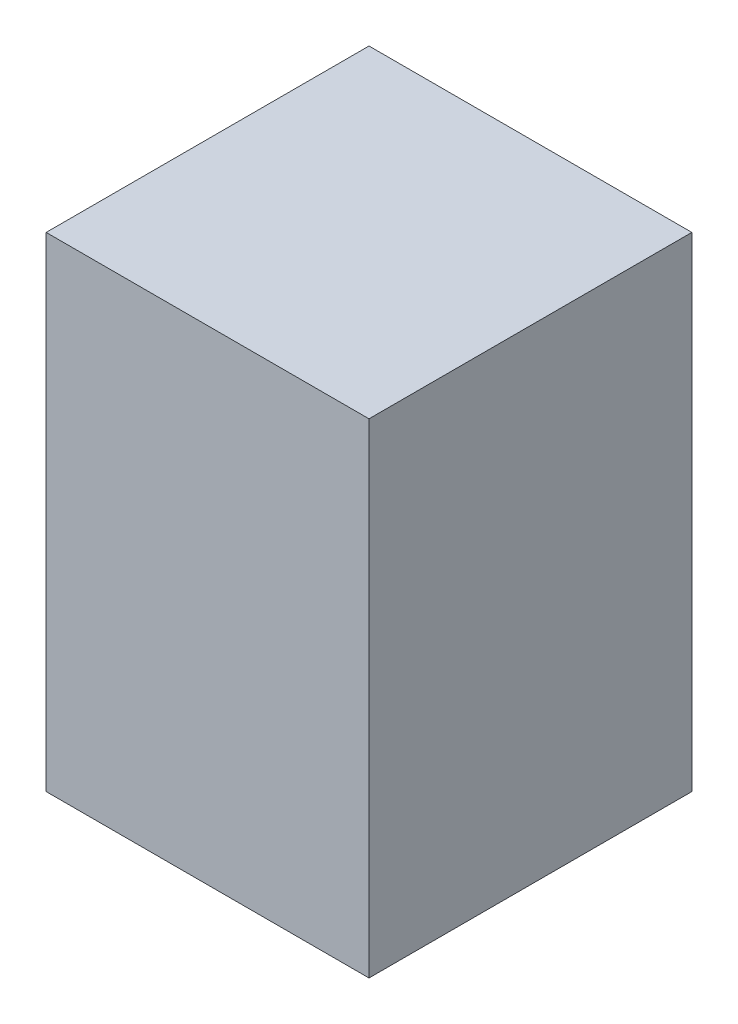
ISO-10303-21;
HEADER;
FILE_DESCRIPTION(('STEP AP214'),'2;1');
FILE_NAME('part.step','',(''),(''),'','','');
FILE_SCHEMA(('AUTOMOTIVE_DESIGN { 1 0 10303 214 1 1 1 1 }'));
ENDSEC;
DATA;
#1=APPLICATION_CONTEXT('core data for automotive mechanical design processes');
#2=APPLICATION_PROTOCOL_DEFINITION('international standard','automotive_design',2000,#1);
#3=PRODUCT_CONTEXT('',#1,'mechanical');
#4=PRODUCT('Part','Part','',(#3));
#5=PRODUCT_RELATED_PRODUCT_CATEGORY('part','',(#4));
#6=PRODUCT_DEFINITION_FORMATION('','',#4);
#7=PRODUCT_DEFINITION_CONTEXT('part definition',#1,'design');
#8=PRODUCT_DEFINITION('design','',#6,#7);
#9=PRODUCT_DEFINITION_SHAPE('','',#8);
#10=(LENGTH_UNIT() NAMED_UNIT(*) SI_UNIT(.MILLI.,.METRE.));
#11=(NAMED_UNIT(*) PLANE_ANGLE_UNIT() SI_UNIT($,.RADIAN.));
#12=(NAMED_UNIT(*) SI_UNIT($,.STERADIAN.) SOLID_ANGLE_UNIT());
#13=UNCERTAINTY_MEASURE_WITH_UNIT(LENGTH_MEASURE(1.E-05),#10,'distance_accuracy_value','');
#14=(GEOMETRIC_REPRESENTATION_CONTEXT(3) GLOBAL_UNCERTAINTY_ASSIGNED_CONTEXT((#13)) GLOBAL_UNIT_ASSIGNED_CONTEXT((#10,
#11,#12)) REPRESENTATION_CONTEXT('',''));
#15=CARTESIAN_POINT('',(0.,0.,0.));
#16=DIRECTION('',(0.,0.,1.));
#17=DIRECTION('',(1.,0.,0.));
#18=AXIS2_PLACEMENT_3D('',#15,#16,#17);
#19=CARTESIAN_POINT('',(1260.,0.,-760.));
#20=DIRECTION('',(-1.,0.,0.));
#21=DIRECTION('',(0.,0.,1.));
#22=AXIS2_PLACEMENT_3D('',#19,#20,#21);
#23=PLANE('',#22);
#24=DIRECTION('',(0.,-1.,0.));
#25=VECTOR('',#24,1.);
#26=CARTESIAN_POINT('',(1260.,0.,-680.));
#27=LINE('',#26,#25);
#28=CARTESIAN_POINT('',(1260.,120.,-680.));
#29=VERTEX_POINT('',#28);
#30=CARTESIAN_POINT('',(1260.,0.,-680.));
#31=VERTEX_POINT('',#30);
#32=EDGE_CURVE('E103',#29,#31,#27,.T.);
#33=ORIENTED_EDGE('',*,*,#32,.F.);
#34=DIRECTION('',(0.,0.,1.));
#35=VECTOR('',#34,1.);
#36=CARTESIAN_POINT('',(1260.,120.,-760.));
#37=LINE('',#36,#35);
#38=CARTESIAN_POINT('',(1260.,120.,-760.));
#39=VERTEX_POINT('',#38);
#40=EDGE_CURVE('E11',#39,#29,#37,.T.);
#41=ORIENTED_EDGE('',*,*,#40,.F.);
#42=DIRECTION('',(0.,-1.,0.));
#43=VECTOR('',#42,1.);
#44=CARTESIAN_POINT('',(1260.,0.,-760.));
#45=LINE('',#44,#43);
#46=CARTESIAN_POINT('',(1260.,0.,-760.));
#47=VERTEX_POINT('',#46);
#48=EDGE_CURVE('E97',#39,#47,#45,.T.);
#49=ORIENTED_EDGE('',*,*,#48,.T.);
#50=DIRECTION('',(0.,0.,1.));
#51=VECTOR('',#50,1.);
#52=CARTESIAN_POINT('',(1260.,0.,-760.));
#53=LINE('',#52,#51);
#54=EDGE_CURVE('E42',#47,#31,#53,.T.);
#55=ORIENTED_EDGE('',*,*,#54,.T.);
#56=EDGE_LOOP('',(#33,#41,#49,#55));
#57=FACE_BOUND('',#56,.T.);
#58=ADVANCED_FACE('F39',(#57),#23,.T.);
#59=CARTESIAN_POINT('',(1260.,120.,-760.));
#60=DIRECTION('',(0.,1.,0.));
#61=DIRECTION('',(0.,0.,1.));
#62=AXIS2_PLACEMENT_3D('',#59,#60,#61);
#63=PLANE('',#62);
#64=DIRECTION('',(-1.,0.,0.));
#65=VECTOR('',#64,1.);
#66=CARTESIAN_POINT('',(1260.,120.,-680.));
#67=LINE('',#66,#65);
#68=CARTESIAN_POINT('',(1340.,120.,-680.));
#69=VERTEX_POINT('',#68);
#70=EDGE_CURVE('E99',#69,#29,#67,.T.);
#71=ORIENTED_EDGE('',*,*,#70,.F.);
#72=DIRECTION('',(0.,0.,1.));
#73=VECTOR('',#72,1.);
#74=CARTESIAN_POINT('',(1340.,120.,-760.));
#75=LINE('',#74,#73);
#76=CARTESIAN_POINT('',(1340.,120.,-760.));
#77=VERTEX_POINT('',#76);
#78=EDGE_CURVE('E48',#77,#69,#75,.T.);
#79=ORIENTED_EDGE('',*,*,#78,.F.);
#80=DIRECTION('',(-1.,0.,0.));
#81=VECTOR('',#80,1.);
#82=CARTESIAN_POINT('',(1260.,120.,-760.));
#83=LINE('',#82,#81);
#84=EDGE_CURVE('E94',#77,#39,#83,.T.);
#85=ORIENTED_EDGE('',*,*,#84,.T.);
#86=ORIENTED_EDGE('',*,*,#40,.T.);
#87=EDGE_LOOP('',(#71,#79,#85,#86));
#88=FACE_BOUND('',#87,.T.);
#89=ADVANCED_FACE('F113',(#88),#63,.T.);
#90=CARTESIAN_POINT('',(1340.,0.,-760.));
#91=DIRECTION('',(1.,0.,0.));
#92=DIRECTION('',(0.,0.,-1.));
#93=AXIS2_PLACEMENT_3D('',#90,#91,#92);
#94=PLANE('',#93);
#95=DIRECTION('',(0.,1.,0.));
#96=VECTOR('',#95,1.);
#97=CARTESIAN_POINT('',(1340.,0.,-680.));
#98=LINE('',#97,#96);
#99=CARTESIAN_POINT('',(1340.,0.,-680.));
#100=VERTEX_POINT('',#99);
#101=EDGE_CURVE('E89',#100,#69,#98,.T.);
#102=ORIENTED_EDGE('',*,*,#101,.F.);
#103=DIRECTION('',(0.,0.,1.));
#104=VECTOR('',#103,1.);
#105=CARTESIAN_POINT('',(1340.,0.,-760.));
#106=LINE('',#105,#104);
#107=CARTESIAN_POINT('',(1340.,0.,-760.));
#108=VERTEX_POINT('',#107);
#109=EDGE_CURVE('E84',#108,#100,#106,.T.);
#110=ORIENTED_EDGE('',*,*,#109,.F.);
#111=DIRECTION('',(0.,1.,0.));
#112=VECTOR('',#111,1.);
#113=CARTESIAN_POINT('',(1340.,0.,-760.));
#114=LINE('',#113,#112);
#115=EDGE_CURVE('E87',#108,#77,#114,.T.);
#116=ORIENTED_EDGE('',*,*,#115,.T.);
#117=ORIENTED_EDGE('',*,*,#78,.T.);
#118=EDGE_LOOP('',(#102,#110,#116,#117));
#119=FACE_BOUND('',#118,.T.);
#120=ADVANCED_FACE('F86',(#119),#94,.T.);
#121=CARTESIAN_POINT('',(1260.,0.,-760.));
#122=DIRECTION('',(0.,-1.,0.));
#123=DIRECTION('',(0.,0.,-1.));
#124=AXIS2_PLACEMENT_3D('',#121,#122,#123);
#125=PLANE('',#124);
#126=DIRECTION('',(1.,0.,0.));
#127=VECTOR('',#126,1.);
#128=CARTESIAN_POINT('',(1260.,0.,-680.));
#129=LINE('',#128,#127);
#130=EDGE_CURVE('E106',#31,#100,#129,.T.);
#131=ORIENTED_EDGE('',*,*,#130,.F.);
#132=ORIENTED_EDGE('',*,*,#54,.F.);
#133=DIRECTION('',(1.,0.,0.));
#134=VECTOR('',#133,1.);
#135=CARTESIAN_POINT('',(1260.,0.,-760.));
#136=LINE('',#135,#134);
#137=EDGE_CURVE('E93',#47,#108,#136,.T.);
#138=ORIENTED_EDGE('',*,*,#137,.T.);
#139=ORIENTED_EDGE('',*,*,#109,.T.);
#140=EDGE_LOOP('',(#131,#132,#138,#139));
#141=FACE_BOUND('',#140,.T.);
#142=ADVANCED_FACE('F96',(#141),#125,.T.);
#143=CARTESIAN_POINT('',(0.,0.,-760.));
#144=DIRECTION('',(0.,0.,-1.));
#145=DIRECTION('',(-1.,0.,0.));
#146=AXIS2_PLACEMENT_3D('',#143,#144,#145);
#147=PLANE('',#146);
#148=ORIENTED_EDGE('',*,*,#48,.F.);
#149=ORIENTED_EDGE('',*,*,#84,.F.);
#150=ORIENTED_EDGE('',*,*,#115,.F.);
#151=ORIENTED_EDGE('',*,*,#137,.F.);
#152=EDGE_LOOP('',(#148,#149,#150,#151));
#153=FACE_BOUND('',#152,.T.);
#154=ADVANCED_FACE('F92',(#153),#147,.T.);
#155=CARTESIAN_POINT('',(0.,0.,-680.));
#156=DIRECTION('',(0.,0.,-1.));
#157=DIRECTION('',(-1.,0.,0.));
#158=AXIS2_PLACEMENT_3D('',#155,#156,#157);
#159=PLANE('',#158);
#160=ORIENTED_EDGE('',*,*,#32,.T.);
#161=ORIENTED_EDGE('',*,*,#130,.T.);
#162=ORIENTED_EDGE('',*,*,#101,.T.);
#163=ORIENTED_EDGE('',*,*,#70,.T.);
#164=EDGE_LOOP('',(#160,#161,#162,#163));
#165=FACE_BOUND('',#164,.T.);
#166=ADVANCED_FACE('F112',(#165),#159,.F.);
#167=CLOSED_SHELL('',(#58,#89,#120,#142,#154,#166));
#168=MANIFOLD_SOLID_BREP('B2',#167);
#169=ADVANCED_BREP_SHAPE_REPRESENTATION('',(#18,#168),#14);
#170=SHAPE_DEFINITION_REPRESENTATION(#9,#169);
ENDSEC;
END-ISO-10303-21;
